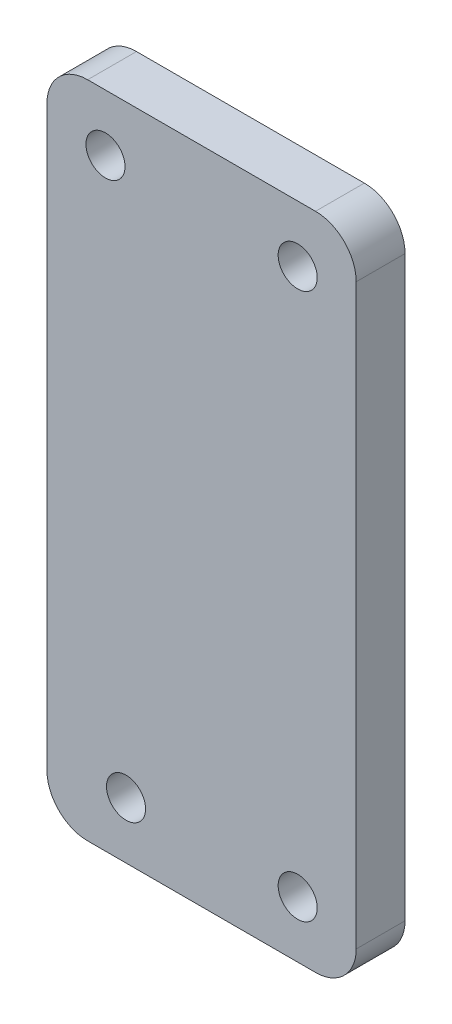
ISO-10303-21;
HEADER;
FILE_DESCRIPTION(('STEP AP214'),'2;1');
FILE_NAME('part.step','',(''),(''),'','','');
FILE_SCHEMA(('AUTOMOTIVE_DESIGN { 1 0 10303 214 1 1 1 1 }'));
ENDSEC;
DATA;
#1=APPLICATION_CONTEXT('core data for automotive mechanical design processes');
#2=APPLICATION_PROTOCOL_DEFINITION('international standard','automotive_design',2000,#1);
#3=PRODUCT_CONTEXT('',#1,'mechanical');
#4=PRODUCT('Part','Part','',(#3));
#5=PRODUCT_RELATED_PRODUCT_CATEGORY('part','',(#4));
#6=PRODUCT_DEFINITION_FORMATION('','',#4);
#7=PRODUCT_DEFINITION_CONTEXT('part definition',#1,'design');
#8=PRODUCT_DEFINITION('design','',#6,#7);
#9=PRODUCT_DEFINITION_SHAPE('','',#8);
#10=(LENGTH_UNIT() NAMED_UNIT(*) SI_UNIT(.MILLI.,.METRE.));
#11=(NAMED_UNIT(*) PLANE_ANGLE_UNIT() SI_UNIT($,.RADIAN.));
#12=(NAMED_UNIT(*) SI_UNIT($,.STERADIAN.) SOLID_ANGLE_UNIT());
#13=UNCERTAINTY_MEASURE_WITH_UNIT(LENGTH_MEASURE(1.E-05),#10,'distance_accuracy_value','');
#14=(GEOMETRIC_REPRESENTATION_CONTEXT(3) GLOBAL_UNCERTAINTY_ASSIGNED_CONTEXT((#13)) GLOBAL_UNIT_ASSIGNED_CONTEXT((#10,
#11,#12)) REPRESENTATION_CONTEXT('',''));
#15=CARTESIAN_POINT('',(0.,0.,0.));
#16=DIRECTION('',(0.,0.,1.));
#17=DIRECTION('',(1.,0.,0.));
#18=AXIS2_PLACEMENT_3D('',#15,#16,#17);
#19=CARTESIAN_POINT('',(19.,40.5,6.));
#20=DIRECTION('',(-1.,0.,0.));
#21=DIRECTION('',(0.,-1.,0.));
#22=AXIS2_PLACEMENT_3D('',#19,#20,#21);
#23=PLANE('',#22);
#24=DIRECTION('',(0.,1.,0.));
#25=VECTOR('',#24,1.);
#26=CARTESIAN_POINT('',(19.,40.5,6.));
#27=LINE('',#26,#25);
#28=CARTESIAN_POINT('',(19.,-35.5,6.));
#29=VERTEX_POINT('',#28);
#30=CARTESIAN_POINT('',(19.,35.5,6.));
#31=VERTEX_POINT('',#30);
#32=EDGE_CURVE('E133',#29,#31,#27,.T.);
#33=ORIENTED_EDGE('',*,*,#32,.F.);
#34=DIRECTION('',(0.,0.,-1.));
#35=VECTOR('',#34,1.);
#36=CARTESIAN_POINT('',(19.,-35.5,6.));
#37=LINE('',#36,#35);
#38=CARTESIAN_POINT('',(19.,-35.5,0.));
#39=VERTEX_POINT('',#38);
#40=EDGE_CURVE('E159',#29,#39,#37,.T.);
#41=ORIENTED_EDGE('',*,*,#40,.T.);
#42=DIRECTION('',(0.,1.,0.));
#43=VECTOR('',#42,1.);
#44=CARTESIAN_POINT('',(19.,40.5,0.));
#45=LINE('',#44,#43);
#46=CARTESIAN_POINT('',(19.,35.5,0.));
#47=VERTEX_POINT('',#46);
#48=EDGE_CURVE('E165',#39,#47,#45,.T.);
#49=ORIENTED_EDGE('',*,*,#48,.T.);
#50=DIRECTION('',(0.,0.,-1.));
#51=VECTOR('',#50,1.);
#52=CARTESIAN_POINT('',(19.,35.5,6.));
#53=LINE('',#52,#51);
#54=EDGE_CURVE('E157',#47,#31,#53,.F.);
#55=ORIENTED_EDGE('',*,*,#54,.T.);
#56=EDGE_LOOP('',(#33,#41,#49,#55));
#57=FACE_BOUND('',#56,.T.);
#58=ADVANCED_FACE('F41',(#57),#23,.F.);
#59=CARTESIAN_POINT('',(-19.,40.5,6.));
#60=DIRECTION('',(0.,-1.,0.));
#61=DIRECTION('',(0.,0.,-1.));
#62=AXIS2_PLACEMENT_3D('',#59,#60,#61);
#63=PLANE('',#62);
#64=DIRECTION('',(-1.,0.,0.));
#65=VECTOR('',#64,1.);
#66=CARTESIAN_POINT('',(-19.,40.5,6.));
#67=LINE('',#66,#65);
#68=CARTESIAN_POINT('',(14.,40.5,6.));
#69=VERTEX_POINT('',#68);
#70=CARTESIAN_POINT('',(-14.,40.5,6.));
#71=VERTEX_POINT('',#70);
#72=EDGE_CURVE('E136',#69,#71,#67,.T.);
#73=ORIENTED_EDGE('',*,*,#72,.F.);
#74=DIRECTION('',(0.,0.,-1.));
#75=VECTOR('',#74,1.);
#76=CARTESIAN_POINT('',(14.,40.5,6.));
#77=LINE('',#76,#75);
#78=CARTESIAN_POINT('',(14.,40.5,0.));
#79=VERTEX_POINT('',#78);
#80=EDGE_CURVE('E11',#69,#79,#77,.T.);
#81=ORIENTED_EDGE('',*,*,#80,.T.);
#82=DIRECTION('',(-1.,0.,0.));
#83=VECTOR('',#82,1.);
#84=CARTESIAN_POINT('',(-19.,40.5,0.));
#85=LINE('',#84,#83);
#86=CARTESIAN_POINT('',(-14.,40.5,0.));
#87=VERTEX_POINT('',#86);
#88=EDGE_CURVE('E138',#79,#87,#85,.T.);
#89=ORIENTED_EDGE('',*,*,#88,.T.);
#90=DIRECTION('',(0.,0.,-1.));
#91=VECTOR('',#90,1.);
#92=CARTESIAN_POINT('',(-14.,40.5,6.));
#93=LINE('',#92,#91);
#94=EDGE_CURVE('E49',#87,#71,#93,.F.);
#95=ORIENTED_EDGE('',*,*,#94,.T.);
#96=EDGE_LOOP('',(#73,#81,#89,#95));
#97=FACE_BOUND('',#96,.T.);
#98=ADVANCED_FACE('F219',(#97),#63,.F.);
#99=CARTESIAN_POINT('',(-19.,40.5,6.));
#100=DIRECTION('',(1.,0.,0.));
#101=DIRECTION('',(0.,1.,0.));
#102=AXIS2_PLACEMENT_3D('',#99,#100,#101);
#103=PLANE('',#102);
#104=DIRECTION('',(0.,-1.,0.));
#105=VECTOR('',#104,1.);
#106=CARTESIAN_POINT('',(-19.,40.5,0.));
#107=LINE('',#106,#105);
#108=CARTESIAN_POINT('',(-19.,35.5,0.));
#109=VERTEX_POINT('',#108);
#110=CARTESIAN_POINT('',(-19.,-35.5,0.));
#111=VERTEX_POINT('',#110);
#112=EDGE_CURVE('E134',#109,#111,#107,.T.);
#113=ORIENTED_EDGE('',*,*,#112,.T.);
#114=DIRECTION('',(0.,0.,-1.));
#115=VECTOR('',#114,1.);
#116=CARTESIAN_POINT('',(-19.,-35.5,6.));
#117=LINE('',#116,#115);
#118=CARTESIAN_POINT('',(-19.,-35.5,6.));
#119=VERTEX_POINT('',#118);
#120=EDGE_CURVE('E112',#111,#119,#117,.F.);
#121=ORIENTED_EDGE('',*,*,#120,.T.);
#122=DIRECTION('',(0.,-1.,0.));
#123=VECTOR('',#122,1.);
#124=CARTESIAN_POINT('',(-19.,40.5,6.));
#125=LINE('',#124,#123);
#126=CARTESIAN_POINT('',(-19.,35.5,6.));
#127=VERTEX_POINT('',#126);
#128=EDGE_CURVE('E177',#127,#119,#125,.T.);
#129=ORIENTED_EDGE('',*,*,#128,.F.);
#130=DIRECTION('',(0.,0.,-1.));
#131=VECTOR('',#130,1.);
#132=CARTESIAN_POINT('',(-19.,35.5,6.));
#133=LINE('',#132,#131);
#134=EDGE_CURVE('E117',#127,#109,#133,.T.);
#135=ORIENTED_EDGE('',*,*,#134,.T.);
#136=EDGE_LOOP('',(#113,#121,#129,#135));
#137=FACE_BOUND('',#136,.T.);
#138=ADVANCED_FACE('F217',(#137),#103,.F.);
#139=CARTESIAN_POINT('',(-19.,-40.5,6.));
#140=DIRECTION('',(0.,1.,0.));
#141=DIRECTION('',(0.,0.,1.));
#142=AXIS2_PLACEMENT_3D('',#139,#140,#141);
#143=PLANE('',#142);
#144=DIRECTION('',(1.,0.,0.));
#145=VECTOR('',#144,1.);
#146=CARTESIAN_POINT('',(-19.,-40.5,6.));
#147=LINE('',#146,#145);
#148=CARTESIAN_POINT('',(-14.,-40.5,6.));
#149=VERTEX_POINT('',#148);
#150=CARTESIAN_POINT('',(14.,-40.5,6.));
#151=VERTEX_POINT('',#150);
#152=EDGE_CURVE('E127',#149,#151,#147,.T.);
#153=ORIENTED_EDGE('',*,*,#152,.F.);
#154=DIRECTION('',(0.,0.,-1.));
#155=VECTOR('',#154,1.);
#156=CARTESIAN_POINT('',(-14.,-40.5,6.));
#157=LINE('',#156,#155);
#158=CARTESIAN_POINT('',(-14.,-40.5,0.));
#159=VERTEX_POINT('',#158);
#160=EDGE_CURVE('E111',#149,#159,#157,.T.);
#161=ORIENTED_EDGE('',*,*,#160,.T.);
#162=DIRECTION('',(1.,0.,0.));
#163=VECTOR('',#162,1.);
#164=CARTESIAN_POINT('',(-19.,-40.5,0.));
#165=LINE('',#164,#163);
#166=CARTESIAN_POINT('',(14.,-40.5,0.));
#167=VERTEX_POINT('',#166);
#168=EDGE_CURVE('E124',#159,#167,#165,.T.);
#169=ORIENTED_EDGE('',*,*,#168,.T.);
#170=DIRECTION('',(0.,0.,-1.));
#171=VECTOR('',#170,1.);
#172=CARTESIAN_POINT('',(14.,-40.5,6.));
#173=LINE('',#172,#171);
#174=EDGE_CURVE('E129',#167,#151,#173,.F.);
#175=ORIENTED_EDGE('',*,*,#174,.T.);
#176=EDGE_LOOP('',(#153,#161,#169,#175));
#177=FACE_BOUND('',#176,.T.);
#178=ADVANCED_FACE('F123',(#177),#143,.F.);
#179=CARTESIAN_POINT('',(0.,0.,6.));
#180=DIRECTION('',(0.,0.,1.));
#181=DIRECTION('',(1.,0.,0.));
#182=AXIS2_PLACEMENT_3D('',#179,#180,#181);
#183=PLANE('',#182);
#184=CARTESIAN_POINT('',(-11.80805,33.54195,6.));
#185=DIRECTION('',(0.,0.,1.));
#186=DIRECTION('',(1.,0.,0.));
#187=AXIS2_PLACEMENT_3D('',#184,#185,#186);
#188=CIRCLE('',#187,2.39999999999999);
#189=CARTESIAN_POINT('',(-9.40805000000002,33.54195,6.));
#190=VERTEX_POINT('',#189);
#191=EDGE_CURVE('E198',#190,#190,#188,.T.);
#192=ORIENTED_EDGE('',*,*,#191,.F.);
#193=EDGE_LOOP('',(#192));
#194=FACE_BOUND('',#193,.T.);
#195=CARTESIAN_POINT('',(11.80805,33.54195,6.));
#196=DIRECTION('',(0.,0.,1.));
#197=DIRECTION('',(1.,0.,0.));
#198=AXIS2_PLACEMENT_3D('',#195,#196,#197);
#199=CIRCLE('',#198,2.39999999999999);
#200=CARTESIAN_POINT('',(14.20805,33.54195,6.));
#201=VERTEX_POINT('',#200);
#202=EDGE_CURVE('E192',#201,#201,#199,.T.);
#203=ORIENTED_EDGE('',*,*,#202,.F.);
#204=EDGE_LOOP('',(#203));
#205=FACE_BOUND('',#204,.T.);
#206=CARTESIAN_POINT('',(11.80805,-33.54195,6.));
#207=DIRECTION('',(0.,0.,1.));
#208=DIRECTION('',(1.,0.,0.));
#209=AXIS2_PLACEMENT_3D('',#206,#207,#208);
#210=CIRCLE('',#209,2.39999999999999);
#211=CARTESIAN_POINT('',(14.20805,-33.54195,6.));
#212=VERTEX_POINT('',#211);
#213=EDGE_CURVE('E186',#212,#212,#210,.T.);
#214=ORIENTED_EDGE('',*,*,#213,.F.);
#215=EDGE_LOOP('',(#214));
#216=FACE_BOUND('',#215,.T.);
#217=CARTESIAN_POINT('',(-9.28424999999999,-33.54195,6.));
#218=DIRECTION('',(0.,0.,1.));
#219=DIRECTION('',(1.,0.,0.));
#220=AXIS2_PLACEMENT_3D('',#217,#218,#219);
#221=CIRCLE('',#220,2.39999999999999);
#222=CARTESIAN_POINT('',(-6.88425000000001,-33.54195,6.));
#223=VERTEX_POINT('',#222);
#224=EDGE_CURVE('E173',#223,#223,#221,.T.);
#225=ORIENTED_EDGE('',*,*,#224,.F.);
#226=EDGE_LOOP('',(#225));
#227=FACE_BOUND('',#226,.T.);
#228=ORIENTED_EDGE('',*,*,#128,.T.);
#229=CARTESIAN_POINT('',(-14.,-35.5,6.));
#230=DIRECTION('',(0.,0.,1.));
#231=DIRECTION('',(1.,0.,0.));
#232=AXIS2_PLACEMENT_3D('',#229,#230,#231);
#233=CIRCLE('',#232,5.);
#234=EDGE_CURVE('E155',#119,#149,#233,.T.);
#235=ORIENTED_EDGE('',*,*,#234,.T.);
#236=ORIENTED_EDGE('',*,*,#152,.T.);
#237=CARTESIAN_POINT('',(14.,-35.5,6.));
#238=DIRECTION('',(0.,0.,1.));
#239=DIRECTION('',(1.,0.,0.));
#240=AXIS2_PLACEMENT_3D('',#237,#238,#239);
#241=CIRCLE('',#240,5.);
#242=EDGE_CURVE('E153',#151,#29,#241,.T.);
#243=ORIENTED_EDGE('',*,*,#242,.T.);
#244=ORIENTED_EDGE('',*,*,#32,.T.);
#245=CARTESIAN_POINT('',(14.,35.5,6.));
#246=DIRECTION('',(0.,0.,1.));
#247=DIRECTION('',(1.,0.,0.));
#248=AXIS2_PLACEMENT_3D('',#245,#246,#247);
#249=CIRCLE('',#248,5.);
#250=EDGE_CURVE('E62',#31,#69,#249,.T.);
#251=ORIENTED_EDGE('',*,*,#250,.T.);
#252=ORIENTED_EDGE('',*,*,#72,.T.);
#253=CARTESIAN_POINT('',(-14.,35.5,6.));
#254=DIRECTION('',(0.,0.,1.));
#255=DIRECTION('',(1.,0.,0.));
#256=AXIS2_PLACEMENT_3D('',#253,#254,#255);
#257=CIRCLE('',#256,5.);
#258=EDGE_CURVE('E150',#71,#127,#257,.T.);
#259=ORIENTED_EDGE('',*,*,#258,.T.);
#260=EDGE_LOOP('',(#228,#235,#236,#243,#244,#251,#252,#259));
#261=FACE_BOUND('',#260,.T.);
#262=ADVANCED_FACE('F204',(#194,#205,#216,#227,#261),#183,.T.);
#263=CARTESIAN_POINT('',(0.,0.,0.));
#264=DIRECTION('',(0.,0.,1.));
#265=DIRECTION('',(1.,0.,0.));
#266=AXIS2_PLACEMENT_3D('',#263,#264,#265);
#267=PLANE('',#266);
#268=CARTESIAN_POINT('',(-11.80805,33.54195,0.));
#269=DIRECTION('',(0.,0.,1.));
#270=DIRECTION('',(1.,0.,0.));
#271=AXIS2_PLACEMENT_3D('',#268,#269,#270);
#272=CIRCLE('',#271,2.4);
#273=CARTESIAN_POINT('',(-9.40805000000001,33.54195,0.));
#274=VERTEX_POINT('',#273);
#275=EDGE_CURVE('E195',#274,#274,#272,.T.);
#276=ORIENTED_EDGE('',*,*,#275,.T.);
#277=EDGE_LOOP('',(#276));
#278=FACE_BOUND('',#277,.T.);
#279=CARTESIAN_POINT('',(11.80805,33.54195,0.));
#280=DIRECTION('',(0.,0.,1.));
#281=DIRECTION('',(1.,0.,0.));
#282=AXIS2_PLACEMENT_3D('',#279,#280,#281);
#283=CIRCLE('',#282,2.4);
#284=CARTESIAN_POINT('',(14.20805,33.54195,0.));
#285=VERTEX_POINT('',#284);
#286=EDGE_CURVE('E189',#285,#285,#283,.T.);
#287=ORIENTED_EDGE('',*,*,#286,.T.);
#288=EDGE_LOOP('',(#287));
#289=FACE_BOUND('',#288,.T.);
#290=CARTESIAN_POINT('',(11.80805,-33.54195,0.));
#291=DIRECTION('',(0.,0.,1.));
#292=DIRECTION('',(1.,0.,0.));
#293=AXIS2_PLACEMENT_3D('',#290,#291,#292);
#294=CIRCLE('',#293,2.4);
#295=CARTESIAN_POINT('',(14.20805,-33.54195,0.));
#296=VERTEX_POINT('',#295);
#297=EDGE_CURVE('E183',#296,#296,#294,.T.);
#298=ORIENTED_EDGE('',*,*,#297,.T.);
#299=EDGE_LOOP('',(#298));
#300=FACE_BOUND('',#299,.T.);
#301=CARTESIAN_POINT('',(-9.28424999999999,-33.54195,0.));
#302=DIRECTION('',(0.,0.,1.));
#303=DIRECTION('',(1.,0.,0.));
#304=AXIS2_PLACEMENT_3D('',#301,#302,#303);
#305=CIRCLE('',#304,2.4);
#306=CARTESIAN_POINT('',(-6.88425,-33.54195,0.));
#307=VERTEX_POINT('',#306);
#308=EDGE_CURVE('E170',#307,#307,#305,.T.);
#309=ORIENTED_EDGE('',*,*,#308,.T.);
#310=EDGE_LOOP('',(#309));
#311=FACE_BOUND('',#310,.T.);
#312=ORIENTED_EDGE('',*,*,#168,.F.);
#313=CARTESIAN_POINT('',(-14.,-35.5,0.));
#314=DIRECTION('',(0.,0.,1.));
#315=DIRECTION('',(1.,0.,0.));
#316=AXIS2_PLACEMENT_3D('',#313,#314,#315);
#317=CIRCLE('',#316,5.);
#318=EDGE_CURVE('E107',#159,#111,#317,.F.);
#319=ORIENTED_EDGE('',*,*,#318,.T.);
#320=ORIENTED_EDGE('',*,*,#112,.F.);
#321=CARTESIAN_POINT('',(-14.,35.5,0.));
#322=DIRECTION('',(0.,0.,1.));
#323=DIRECTION('',(1.,0.,0.));
#324=AXIS2_PLACEMENT_3D('',#321,#322,#323);
#325=CIRCLE('',#324,5.);
#326=EDGE_CURVE('E128',#109,#87,#325,.F.);
#327=ORIENTED_EDGE('',*,*,#326,.T.);
#328=ORIENTED_EDGE('',*,*,#88,.F.);
#329=CARTESIAN_POINT('',(14.,35.5,0.));
#330=DIRECTION('',(0.,0.,1.));
#331=DIRECTION('',(1.,0.,0.));
#332=AXIS2_PLACEMENT_3D('',#329,#330,#331);
#333=CIRCLE('',#332,5.);
#334=EDGE_CURVE('E144',#79,#47,#333,.F.);
#335=ORIENTED_EDGE('',*,*,#334,.T.);
#336=ORIENTED_EDGE('',*,*,#48,.F.);
#337=CARTESIAN_POINT('',(14.,-35.5,0.));
#338=DIRECTION('',(0.,0.,1.));
#339=DIRECTION('',(1.,0.,0.));
#340=AXIS2_PLACEMENT_3D('',#337,#338,#339);
#341=CIRCLE('',#340,5.);
#342=EDGE_CURVE('E118',#39,#167,#341,.F.);
#343=ORIENTED_EDGE('',*,*,#342,.T.);
#344=EDGE_LOOP('',(#312,#319,#320,#327,#328,#335,#336,#343));
#345=FACE_BOUND('',#344,.T.);
#346=ADVANCED_FACE('F131',(#278,#289,#300,#311,#345),#267,.F.);
#347=CARTESIAN_POINT('',(-9.28424999999999,-33.54195,6.));
#348=DIRECTION('',(0.,0.,1.));
#349=DIRECTION('',(1.,0.,0.));
#350=AXIS2_PLACEMENT_3D('',#347,#348,#349);
#351=CYLINDRICAL_SURFACE('',#350,2.39999999999999);
#352=ORIENTED_EDGE('',*,*,#308,.F.);
#353=EDGE_LOOP('',(#352));
#354=FACE_BOUND('',#353,.T.);
#355=ORIENTED_EDGE('',*,*,#224,.T.);
#356=EDGE_LOOP('',(#355));
#357=FACE_BOUND('',#356,.T.);
#358=ADVANCED_FACE('F244',(#354,#357),#351,.F.);
#359=CARTESIAN_POINT('',(11.80805,-33.54195,6.));
#360=DIRECTION('',(0.,0.,1.));
#361=DIRECTION('',(1.,0.,0.));
#362=AXIS2_PLACEMENT_3D('',#359,#360,#361);
#363=CYLINDRICAL_SURFACE('',#362,2.39999999999999);
#364=ORIENTED_EDGE('',*,*,#297,.F.);
#365=EDGE_LOOP('',(#364));
#366=FACE_BOUND('',#365,.T.);
#367=ORIENTED_EDGE('',*,*,#213,.T.);
#368=EDGE_LOOP('',(#367));
#369=FACE_BOUND('',#368,.T.);
#370=ADVANCED_FACE('F249',(#366,#369),#363,.F.);
#371=CARTESIAN_POINT('',(11.80805,33.54195,6.));
#372=DIRECTION('',(0.,0.,1.));
#373=DIRECTION('',(1.,0.,0.));
#374=AXIS2_PLACEMENT_3D('',#371,#372,#373);
#375=CYLINDRICAL_SURFACE('',#374,2.39999999999999);
#376=ORIENTED_EDGE('',*,*,#286,.F.);
#377=EDGE_LOOP('',(#376));
#378=FACE_BOUND('',#377,.T.);
#379=ORIENTED_EDGE('',*,*,#202,.T.);
#380=EDGE_LOOP('',(#379));
#381=FACE_BOUND('',#380,.T.);
#382=ADVANCED_FACE('F253',(#378,#381),#375,.F.);
#383=CARTESIAN_POINT('',(-11.80805,33.54195,6.));
#384=DIRECTION('',(0.,0.,1.));
#385=DIRECTION('',(1.,0.,0.));
#386=AXIS2_PLACEMENT_3D('',#383,#384,#385);
#387=CYLINDRICAL_SURFACE('',#386,2.39999999999999);
#388=ORIENTED_EDGE('',*,*,#275,.F.);
#389=EDGE_LOOP('',(#388));
#390=FACE_BOUND('',#389,.T.);
#391=ORIENTED_EDGE('',*,*,#191,.T.);
#392=EDGE_LOOP('',(#391));
#393=FACE_BOUND('',#392,.T.);
#394=ADVANCED_FACE('F202',(#390,#393),#387,.F.);
#395=CARTESIAN_POINT('',(-14.,-35.5,6.));
#396=DIRECTION('',(0.,0.,-1.));
#397=DIRECTION('',(-1.,0.,0.));
#398=AXIS2_PLACEMENT_3D('',#395,#396,#397);
#399=CYLINDRICAL_SURFACE('',#398,5.);
#400=ORIENTED_EDGE('',*,*,#234,.F.);
#401=ORIENTED_EDGE('',*,*,#120,.F.);
#402=ORIENTED_EDGE('',*,*,#318,.F.);
#403=ORIENTED_EDGE('',*,*,#160,.F.);
#404=EDGE_LOOP('',(#400,#401,#402,#403));
#405=FACE_BOUND('',#404,.T.);
#406=ADVANCED_FACE('F110',(#405),#399,.T.);
#407=CARTESIAN_POINT('',(14.,-35.5,6.));
#408=DIRECTION('',(0.,0.,-1.));
#409=DIRECTION('',(-1.,0.,0.));
#410=AXIS2_PLACEMENT_3D('',#407,#408,#409);
#411=CYLINDRICAL_SURFACE('',#410,5.);
#412=ORIENTED_EDGE('',*,*,#242,.F.);
#413=ORIENTED_EDGE('',*,*,#174,.F.);
#414=ORIENTED_EDGE('',*,*,#342,.F.);
#415=ORIENTED_EDGE('',*,*,#40,.F.);
#416=EDGE_LOOP('',(#412,#413,#414,#415));
#417=FACE_BOUND('',#416,.T.);
#418=ADVANCED_FACE('F223',(#417),#411,.T.);
#419=CARTESIAN_POINT('',(14.,35.5,6.));
#420=DIRECTION('',(0.,0.,-1.));
#421=DIRECTION('',(-1.,0.,0.));
#422=AXIS2_PLACEMENT_3D('',#419,#420,#421);
#423=CYLINDRICAL_SURFACE('',#422,5.);
#424=ORIENTED_EDGE('',*,*,#250,.F.);
#425=ORIENTED_EDGE('',*,*,#54,.F.);
#426=ORIENTED_EDGE('',*,*,#334,.F.);
#427=ORIENTED_EDGE('',*,*,#80,.F.);
#428=EDGE_LOOP('',(#424,#425,#426,#427));
#429=FACE_BOUND('',#428,.T.);
#430=ADVANCED_FACE('F222',(#429),#423,.T.);
#431=CARTESIAN_POINT('',(-14.,35.5,6.));
#432=DIRECTION('',(0.,0.,-1.));
#433=DIRECTION('',(-1.,0.,0.));
#434=AXIS2_PLACEMENT_3D('',#431,#432,#433);
#435=CYLINDRICAL_SURFACE('',#434,5.);
#436=ORIENTED_EDGE('',*,*,#258,.F.);
#437=ORIENTED_EDGE('',*,*,#94,.F.);
#438=ORIENTED_EDGE('',*,*,#326,.F.);
#439=ORIENTED_EDGE('',*,*,#134,.F.);
#440=EDGE_LOOP('',(#436,#437,#438,#439));
#441=FACE_BOUND('',#440,.T.);
#442=ADVANCED_FACE('F43',(#441),#435,.T.);
#443=CLOSED_SHELL('',(#58,#98,#138,#178,#262,#346,#358,#370,#382,#394,#406,#418,#430,#442));
#444=MANIFOLD_SOLID_BREP('B2',#443);
#445=ADVANCED_BREP_SHAPE_REPRESENTATION('',(#18,#444),#14);
#446=SHAPE_DEFINITION_REPRESENTATION(#9,#445);
ENDSEC;
END-ISO-10303-21;
